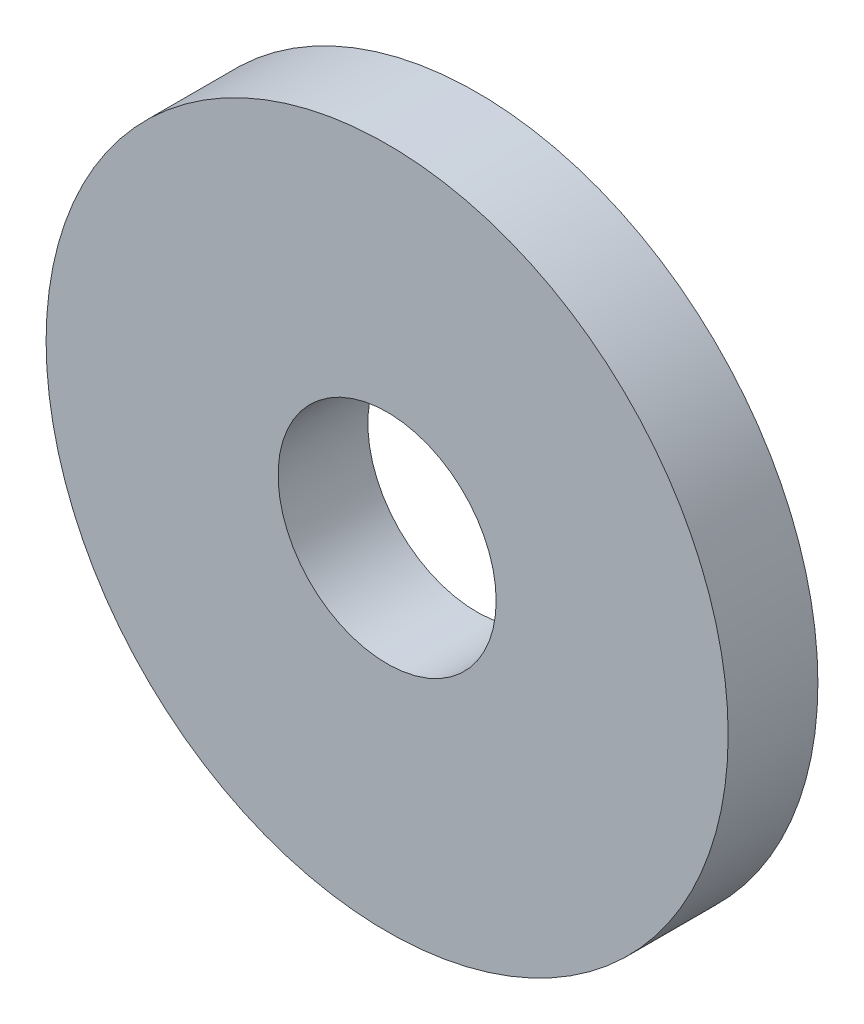
ISO-10303-21;
HEADER;
FILE_DESCRIPTION(('STEP AP214'),'2;1');
FILE_NAME('part.step','',(''),(''),'','','');
FILE_SCHEMA(('AUTOMOTIVE_DESIGN { 1 0 10303 214 1 1 1 1 }'));
ENDSEC;
DATA;
#1=APPLICATION_CONTEXT('core data for automotive mechanical design processes');
#2=APPLICATION_PROTOCOL_DEFINITION('international standard','automotive_design',2000,#1);
#3=PRODUCT_CONTEXT('',#1,'mechanical');
#4=PRODUCT('Part','Part','',(#3));
#5=PRODUCT_RELATED_PRODUCT_CATEGORY('part','',(#4));
#6=PRODUCT_DEFINITION_FORMATION('','',#4);
#7=PRODUCT_DEFINITION_CONTEXT('part definition',#1,'design');
#8=PRODUCT_DEFINITION('design','',#6,#7);
#9=PRODUCT_DEFINITION_SHAPE('','',#8);
#10=(LENGTH_UNIT() NAMED_UNIT(*) SI_UNIT(.MILLI.,.METRE.));
#11=(NAMED_UNIT(*) PLANE_ANGLE_UNIT() SI_UNIT($,.RADIAN.));
#12=(NAMED_UNIT(*) SI_UNIT($,.STERADIAN.) SOLID_ANGLE_UNIT());
#13=UNCERTAINTY_MEASURE_WITH_UNIT(LENGTH_MEASURE(1.E-05),#10,'distance_accuracy_value','');
#14=(GEOMETRIC_REPRESENTATION_CONTEXT(3) GLOBAL_UNCERTAINTY_ASSIGNED_CONTEXT((#13)) GLOBAL_UNIT_ASSIGNED_CONTEXT((#10,
#11,#12)) REPRESENTATION_CONTEXT('',''));
#15=CARTESIAN_POINT('',(0.,0.,0.));
#16=DIRECTION('',(0.,0.,1.));
#17=DIRECTION('',(1.,0.,0.));
#18=AXIS2_PLACEMENT_3D('',#15,#16,#17);
#19=CARTESIAN_POINT('',(0.,0.,5.));
#20=DIRECTION('',(0.,0.,1.));
#21=DIRECTION('',(1.,0.,0.));
#22=AXIS2_PLACEMENT_3D('',#19,#20,#21);
#23=PLANE('',#22);
#24=CARTESIAN_POINT('',(0.,0.,5.));
#25=DIRECTION('',(0.,0.,1.));
#26=DIRECTION('',(1.,0.,0.));
#27=AXIS2_PLACEMENT_3D('',#24,#25,#26);
#28=CIRCLE('',#27,19.);
#29=CARTESIAN_POINT('',(19.,0.,5.));
#30=VERTEX_POINT('',#29);
#31=EDGE_CURVE('E10',#30,#30,#28,.T.);
#32=ORIENTED_EDGE('',*,*,#31,.T.);
#33=EDGE_LOOP('',(#32));
#34=FACE_BOUND('',#33,.T.);
#35=CARTESIAN_POINT('',(0.,0.,5.));
#36=DIRECTION('',(0.,0.,1.));
#37=DIRECTION('',(1.,0.,0.));
#38=AXIS2_PLACEMENT_3D('',#35,#36,#37);
#39=CIRCLE('',#38,6.075);
#40=CARTESIAN_POINT('',(6.075,0.,5.));
#41=VERTEX_POINT('',#40);
#42=EDGE_CURVE('E52',#41,#41,#39,.T.);
#43=ORIENTED_EDGE('',*,*,#42,.F.);
#44=EDGE_LOOP('',(#43));
#45=FACE_BOUND('',#44,.T.);
#46=ADVANCED_FACE('F39',(#34,#45),#23,.T.);
#47=CARTESIAN_POINT('',(0.,0.,0.));
#48=DIRECTION('',(0.,0.,1.));
#49=DIRECTION('',(1.,0.,0.));
#50=AXIS2_PLACEMENT_3D('',#47,#48,#49);
#51=PLANE('',#50);
#52=CARTESIAN_POINT('',(0.,0.,0.));
#53=DIRECTION('',(0.,0.,1.));
#54=DIRECTION('',(1.,0.,0.));
#55=AXIS2_PLACEMENT_3D('',#52,#53,#54);
#56=CIRCLE('',#55,19.);
#57=CARTESIAN_POINT('',(19.,0.,0.));
#58=VERTEX_POINT('',#57);
#59=EDGE_CURVE('E43',#58,#58,#56,.T.);
#60=ORIENTED_EDGE('',*,*,#59,.F.);
#61=EDGE_LOOP('',(#60));
#62=FACE_BOUND('',#61,.T.);
#63=CARTESIAN_POINT('',(0.,0.,0.));
#64=DIRECTION('',(0.,0.,1.));
#65=DIRECTION('',(1.,0.,0.));
#66=AXIS2_PLACEMENT_3D('',#63,#64,#65);
#67=CIRCLE('',#66,6.075);
#68=CARTESIAN_POINT('',(6.075,0.,0.));
#69=VERTEX_POINT('',#68);
#70=EDGE_CURVE('E54',#69,#69,#67,.T.);
#71=ORIENTED_EDGE('',*,*,#70,.T.);
#72=EDGE_LOOP('',(#71));
#73=FACE_BOUND('',#72,.T.);
#74=ADVANCED_FACE('F65',(#62,#73),#51,.F.);
#75=CARTESIAN_POINT('',(0.,0.,5.));
#76=DIRECTION('',(0.,0.,-1.));
#77=DIRECTION('',(-1.,0.,0.));
#78=AXIS2_PLACEMENT_3D('',#75,#76,#77);
#79=CYLINDRICAL_SURFACE('',#78,19.);
#80=ORIENTED_EDGE('',*,*,#31,.F.);
#81=EDGE_LOOP('',(#80));
#82=FACE_BOUND('',#81,.T.);
#83=ORIENTED_EDGE('',*,*,#59,.T.);
#84=EDGE_LOOP('',(#83));
#85=FACE_BOUND('',#84,.T.);
#86=ADVANCED_FACE('F41',(#82,#85),#79,.T.);
#87=CARTESIAN_POINT('',(0.,0.,5.));
#88=DIRECTION('',(0.,0.,-1.));
#89=DIRECTION('',(-1.,0.,0.));
#90=AXIS2_PLACEMENT_3D('',#87,#88,#89);
#91=CYLINDRICAL_SURFACE('',#90,6.075);
#92=ORIENTED_EDGE('',*,*,#42,.T.);
#93=EDGE_LOOP('',(#92));
#94=FACE_BOUND('',#93,.T.);
#95=ORIENTED_EDGE('',*,*,#70,.F.);
#96=EDGE_LOOP('',(#95));
#97=FACE_BOUND('',#96,.T.);
#98=ADVANCED_FACE('F61',(#94,#97),#91,.F.);
#99=CLOSED_SHELL('',(#46,#74,#86,#98));
#100=MANIFOLD_SOLID_BREP('B2',#99);
#101=ADVANCED_BREP_SHAPE_REPRESENTATION('',(#18,#100),#14);
#102=SHAPE_DEFINITION_REPRESENTATION(#9,#101);
ENDSEC;
END-ISO-10303-21;
